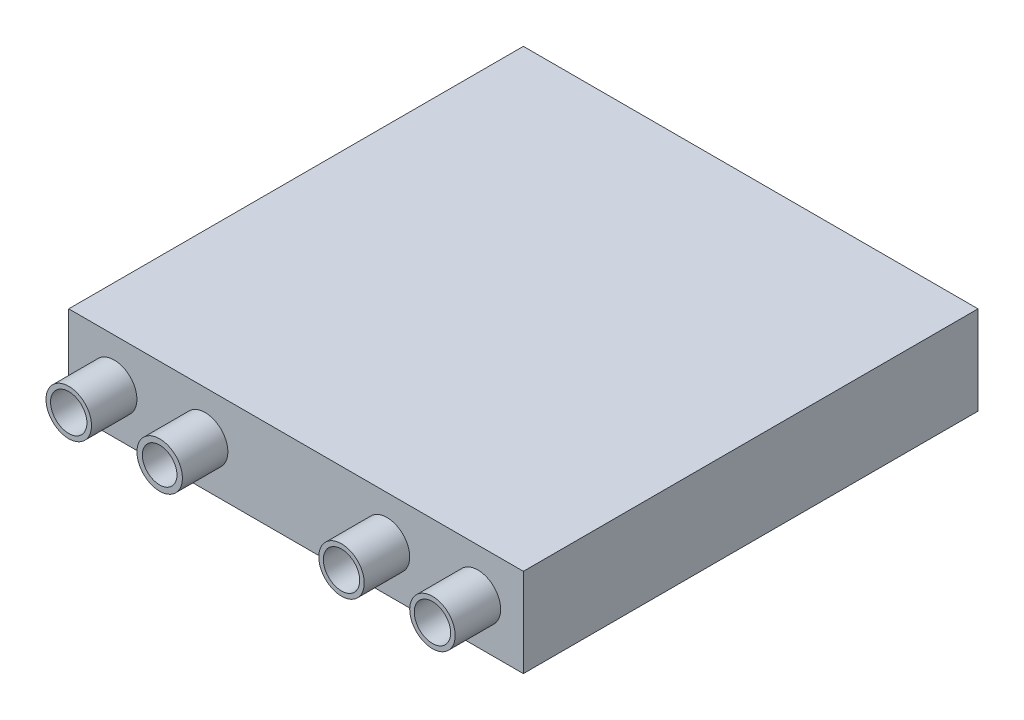
ISO-10303-21;
HEADER;
FILE_DESCRIPTION(('STEP AP214'),'2;1');
FILE_NAME('part.step','',(''),(''),'','','');
FILE_SCHEMA(('AUTOMOTIVE_DESIGN { 1 0 10303 214 1 1 1 1 }'));
ENDSEC;
DATA;
#1=APPLICATION_CONTEXT('core data for automotive mechanical design processes');
#2=APPLICATION_PROTOCOL_DEFINITION('international standard','automotive_design',2000,#1);
#3=PRODUCT_CONTEXT('',#1,'mechanical');
#4=PRODUCT('Part','Part','',(#3));
#5=PRODUCT_RELATED_PRODUCT_CATEGORY('part','',(#4));
#6=PRODUCT_DEFINITION_FORMATION('','',#4);
#7=PRODUCT_DEFINITION_CONTEXT('part definition',#1,'design');
#8=PRODUCT_DEFINITION('design','',#6,#7);
#9=PRODUCT_DEFINITION_SHAPE('','',#8);
#10=(LENGTH_UNIT() NAMED_UNIT(*) SI_UNIT(.MILLI.,.METRE.));
#11=(NAMED_UNIT(*) PLANE_ANGLE_UNIT() SI_UNIT($,.RADIAN.));
#12=(NAMED_UNIT(*) SI_UNIT($,.STERADIAN.) SOLID_ANGLE_UNIT());
#13=UNCERTAINTY_MEASURE_WITH_UNIT(LENGTH_MEASURE(1.E-05),#10,'distance_accuracy_value','');
#14=(GEOMETRIC_REPRESENTATION_CONTEXT(3) GLOBAL_UNCERTAINTY_ASSIGNED_CONTEXT((#13)) GLOBAL_UNIT_ASSIGNED_CONTEXT((#10,
#11,#12)) REPRESENTATION_CONTEXT('',''));
#15=CARTESIAN_POINT('',(0.,0.,0.));
#16=DIRECTION('',(0.,0.,1.));
#17=DIRECTION('',(1.,0.,0.));
#18=AXIS2_PLACEMENT_3D('',#15,#16,#17);
#19=CARTESIAN_POINT('',(0.,-195.,1000.));
#20=DIRECTION('',(0.,1.,0.));
#21=DIRECTION('',(0.,0.,1.));
#22=AXIS2_PLACEMENT_3D('',#19,#20,#21);
#23=PLANE('',#22);
#24=DIRECTION('',(1.,0.,0.));
#25=VECTOR('',#24,1.);
#26=CARTESIAN_POINT('',(0.,-195.,0.));
#27=LINE('',#26,#25);
#28=CARTESIAN_POINT('',(0.,-195.,0.));
#29=VERTEX_POINT('',#28);
#30=CARTESIAN_POINT('',(1000.,-195.,0.));
#31=VERTEX_POINT('',#30);
#32=EDGE_CURVE('E117',#29,#31,#27,.T.);
#33=ORIENTED_EDGE('',*,*,#32,.T.);
#34=DIRECTION('',(0.,0.,-1.));
#35=VECTOR('',#34,1.);
#36=CARTESIAN_POINT('',(1000.,-195.,1000.));
#37=LINE('',#36,#35);
#38=CARTESIAN_POINT('',(1000.,-195.,1000.));
#39=VERTEX_POINT('',#38);
#40=EDGE_CURVE('E103',#39,#31,#37,.T.);
#41=ORIENTED_EDGE('',*,*,#40,.F.);
#42=DIRECTION('',(1.,0.,0.));
#43=VECTOR('',#42,1.);
#44=CARTESIAN_POINT('',(0.,-195.,1000.));
#45=LINE('',#44,#43);
#46=CARTESIAN_POINT('',(0.,-195.,1000.));
#47=VERTEX_POINT('',#46);
#48=EDGE_CURVE('E87',#47,#39,#45,.T.);
#49=ORIENTED_EDGE('',*,*,#48,.F.);
#50=DIRECTION('',(0.,0.,-1.));
#51=VECTOR('',#50,1.);
#52=CARTESIAN_POINT('',(0.,-195.,1000.));
#53=LINE('',#52,#51);
#54=EDGE_CURVE('E113',#47,#29,#53,.T.);
#55=ORIENTED_EDGE('',*,*,#54,.T.);
#56=EDGE_LOOP('',(#33,#41,#49,#55));
#57=FACE_BOUND('',#56,.T.);
#58=ADVANCED_FACE('F46',(#57),#23,.F.);
#59=CARTESIAN_POINT('',(1000.,0.,1000.));
#60=DIRECTION('',(1.,0.,0.));
#61=DIRECTION('',(0.,1.,0.));
#62=AXIS2_PLACEMENT_3D('',#59,#60,#61);
#63=PLANE('',#62);
#64=DIRECTION('',(0.,-1.,0.));
#65=VECTOR('',#64,1.);
#66=CARTESIAN_POINT('',(1000.,0.,0.));
#67=LINE('',#66,#65);
#68=CARTESIAN_POINT('',(1000.,0.,0.));
#69=VERTEX_POINT('',#68);
#70=EDGE_CURVE('E97',#69,#31,#67,.T.);
#71=ORIENTED_EDGE('',*,*,#70,.F.);
#72=DIRECTION('',(0.,0.,-1.));
#73=VECTOR('',#72,1.);
#74=CARTESIAN_POINT('',(1000.,0.,1000.));
#75=LINE('',#74,#73);
#76=CARTESIAN_POINT('',(1000.,0.,1000.));
#77=VERTEX_POINT('',#76);
#78=EDGE_CURVE('E93',#77,#69,#75,.T.);
#79=ORIENTED_EDGE('',*,*,#78,.F.);
#80=DIRECTION('',(0.,-1.,0.));
#81=VECTOR('',#80,1.);
#82=CARTESIAN_POINT('',(1000.,0.,1000.));
#83=LINE('',#82,#81);
#84=EDGE_CURVE('E95',#77,#39,#83,.T.);
#85=ORIENTED_EDGE('',*,*,#84,.T.);
#86=ORIENTED_EDGE('',*,*,#40,.T.);
#87=EDGE_LOOP('',(#71,#79,#85,#86));
#88=FACE_BOUND('',#87,.T.);
#89=ADVANCED_FACE('F94',(#88),#63,.T.);
#90=CARTESIAN_POINT('',(0.,0.,1000.));
#91=DIRECTION('',(0.,1.,0.));
#92=DIRECTION('',(0.,0.,1.));
#93=AXIS2_PLACEMENT_3D('',#90,#91,#92);
#94=PLANE('',#93);
#95=DIRECTION('',(1.,0.,0.));
#96=VECTOR('',#95,1.);
#97=CARTESIAN_POINT('',(0.,0.,0.));
#98=LINE('',#97,#96);
#99=CARTESIAN_POINT('',(0.,0.,0.));
#100=VERTEX_POINT('',#99);
#101=EDGE_CURVE('E124',#100,#69,#98,.T.);
#102=ORIENTED_EDGE('',*,*,#101,.F.);
#103=DIRECTION('',(0.,0.,-1.));
#104=VECTOR('',#103,1.);
#105=CARTESIAN_POINT('',(0.,0.,1000.));
#106=LINE('',#105,#104);
#107=CARTESIAN_POINT('',(0.,0.,1000.));
#108=VERTEX_POINT('',#107);
#109=EDGE_CURVE('E79',#108,#100,#106,.T.);
#110=ORIENTED_EDGE('',*,*,#109,.F.);
#111=DIRECTION('',(1.,0.,0.));
#112=VECTOR('',#111,1.);
#113=CARTESIAN_POINT('',(0.,0.,1000.));
#114=LINE('',#113,#112);
#115=EDGE_CURVE('E106',#108,#77,#114,.T.);
#116=ORIENTED_EDGE('',*,*,#115,.T.);
#117=ORIENTED_EDGE('',*,*,#78,.T.);
#118=EDGE_LOOP('',(#102,#110,#116,#117));
#119=FACE_BOUND('',#118,.T.);
#120=ADVANCED_FACE('F109',(#119),#94,.T.);
#121=CARTESIAN_POINT('',(0.,0.,1000.));
#122=DIRECTION('',(1.,0.,0.));
#123=DIRECTION('',(0.,1.,0.));
#124=AXIS2_PLACEMENT_3D('',#121,#122,#123);
#125=PLANE('',#124);
#126=DIRECTION('',(0.,-1.,0.));
#127=VECTOR('',#126,1.);
#128=CARTESIAN_POINT('',(0.,0.,0.));
#129=LINE('',#128,#127);
#130=EDGE_CURVE('E82',#100,#29,#129,.T.);
#131=ORIENTED_EDGE('',*,*,#130,.T.);
#132=ORIENTED_EDGE('',*,*,#54,.F.);
#133=DIRECTION('',(0.,-1.,0.));
#134=VECTOR('',#133,1.);
#135=CARTESIAN_POINT('',(0.,0.,1000.));
#136=LINE('',#135,#134);
#137=EDGE_CURVE('E63',#108,#47,#136,.T.);
#138=ORIENTED_EDGE('',*,*,#137,.F.);
#139=ORIENTED_EDGE('',*,*,#109,.T.);
#140=EDGE_LOOP('',(#131,#132,#138,#139));
#141=FACE_BOUND('',#140,.T.);
#142=ADVANCED_FACE('F151',(#141),#125,.F.);
#143=CARTESIAN_POINT('',(0.,0.,1000.));
#144=DIRECTION('',(0.,0.,-1.));
#145=DIRECTION('',(-1.,0.,0.));
#146=AXIS2_PLACEMENT_3D('',#143,#144,#145);
#147=PLANE('',#146);
#148=CARTESIAN_POINT('',(900.,-97.5,1000.));
#149=DIRECTION('',(0.,0.,-1.));
#150=DIRECTION('',(-1.,0.,0.));
#151=AXIS2_PLACEMENT_3D('',#148,#149,#150);
#152=CIRCLE('',#151,50.);
#153=CARTESIAN_POINT('',(850.,-97.5,1000.));
#154=VERTEX_POINT('',#153);
#155=EDGE_CURVE('E11',#154,#154,#152,.F.);
#156=ORIENTED_EDGE('',*,*,#155,.F.);
#157=EDGE_LOOP('',(#156));
#158=FACE_BOUND('',#157,.T.);
#159=CARTESIAN_POINT('',(700.,-97.5,1000.));
#160=DIRECTION('',(0.,0.,-1.));
#161=DIRECTION('',(-1.,0.,0.));
#162=AXIS2_PLACEMENT_3D('',#159,#160,#161);
#163=CIRCLE('',#162,50.);
#164=CARTESIAN_POINT('',(650.,-97.5,1000.));
#165=VERTEX_POINT('',#164);
#166=EDGE_CURVE('E55',#165,#165,#163,.F.);
#167=ORIENTED_EDGE('',*,*,#166,.F.);
#168=EDGE_LOOP('',(#167));
#169=FACE_BOUND('',#168,.T.);
#170=CARTESIAN_POINT('',(300.,-97.5,1000.));
#171=DIRECTION('',(0.,0.,-1.));
#172=DIRECTION('',(-1.,0.,0.));
#173=AXIS2_PLACEMENT_3D('',#170,#171,#172);
#174=CIRCLE('',#173,50.);
#175=CARTESIAN_POINT('',(250.,-97.5,1000.));
#176=VERTEX_POINT('',#175);
#177=EDGE_CURVE('E139',#176,#176,#174,.F.);
#178=ORIENTED_EDGE('',*,*,#177,.F.);
#179=EDGE_LOOP('',(#178));
#180=FACE_BOUND('',#179,.T.);
#181=CARTESIAN_POINT('',(100.,-97.5,1000.));
#182=DIRECTION('',(0.,0.,-1.));
#183=DIRECTION('',(-1.,0.,0.));
#184=AXIS2_PLACEMENT_3D('',#181,#182,#183);
#185=CIRCLE('',#184,50.);
#186=CARTESIAN_POINT('',(50.,-97.5,1000.));
#187=VERTEX_POINT('',#186);
#188=EDGE_CURVE('E135',#187,#187,#185,.F.);
#189=ORIENTED_EDGE('',*,*,#188,.F.);
#190=EDGE_LOOP('',(#189));
#191=FACE_BOUND('',#190,.T.);
#192=ORIENTED_EDGE('',*,*,#48,.T.);
#193=ORIENTED_EDGE('',*,*,#84,.F.);
#194=ORIENTED_EDGE('',*,*,#115,.F.);
#195=ORIENTED_EDGE('',*,*,#137,.T.);
#196=EDGE_LOOP('',(#192,#193,#194,#195));
#197=FACE_BOUND('',#196,.T.);
#198=ADVANCED_FACE('F105',(#158,#169,#180,#191,#197),#147,.F.);
#199=CARTESIAN_POINT('',(0.,0.,0.));
#200=DIRECTION('',(0.,0.,-1.));
#201=DIRECTION('',(-1.,0.,0.));
#202=AXIS2_PLACEMENT_3D('',#199,#200,#201);
#203=PLANE('',#202);
#204=ORIENTED_EDGE('',*,*,#32,.F.);
#205=ORIENTED_EDGE('',*,*,#130,.F.);
#206=ORIENTED_EDGE('',*,*,#101,.T.);
#207=ORIENTED_EDGE('',*,*,#70,.T.);
#208=EDGE_LOOP('',(#204,#205,#206,#207));
#209=FACE_BOUND('',#208,.T.);
#210=ADVANCED_FACE('F150',(#209),#203,.T.);
#211=CARTESIAN_POINT('',(100.,-97.5,1100.));
#212=DIRECTION('',(0.,0.,1.));
#213=DIRECTION('',(1.,0.,0.));
#214=AXIS2_PLACEMENT_3D('',#211,#212,#213);
#215=PLANE('',#214);
#216=CARTESIAN_POINT('',(100.,-97.5,1100.));
#217=DIRECTION('',(0.,0.,1.));
#218=DIRECTION('',(1.,0.,0.));
#219=AXIS2_PLACEMENT_3D('',#216,#217,#218);
#220=CIRCLE('',#219,50.);
#221=CARTESIAN_POINT('',(150.,-97.5,1100.));
#222=VERTEX_POINT('',#221);
#223=EDGE_CURVE('E121',#222,#222,#220,.T.);
#224=ORIENTED_EDGE('',*,*,#223,.T.);
#225=EDGE_LOOP('',(#224));
#226=FACE_BOUND('',#225,.T.);
#227=CARTESIAN_POINT('',(100.,-97.5,1100.));
#228=DIRECTION('',(0.,0.,1.));
#229=DIRECTION('',(1.,0.,0.));
#230=AXIS2_PLACEMENT_3D('',#227,#228,#229);
#231=CIRCLE('',#230,40.);
#232=CARTESIAN_POINT('',(140.,-97.5,1100.));
#233=VERTEX_POINT('',#232);
#234=EDGE_CURVE('E500',#233,#233,#231,.T.);
#235=ORIENTED_EDGE('',*,*,#234,.F.);
#236=EDGE_LOOP('',(#235));
#237=FACE_BOUND('',#236,.T.);
#238=ADVANCED_FACE('F161',(#226,#237),#215,.T.);
#239=CARTESIAN_POINT('',(100.,-97.5,1100.));
#240=DIRECTION('',(0.,0.,-1.));
#241=DIRECTION('',(-1.,0.,0.));
#242=AXIS2_PLACEMENT_3D('',#239,#240,#241);
#243=CYLINDRICAL_SURFACE('',#242,50.);
#244=ORIENTED_EDGE('',*,*,#223,.F.);
#245=EDGE_LOOP('',(#244));
#246=FACE_BOUND('',#245,.T.);
#247=ORIENTED_EDGE('',*,*,#188,.T.);
#248=EDGE_LOOP('',(#247));
#249=FACE_BOUND('',#248,.T.);
#250=ADVANCED_FACE('F158',(#246,#249),#243,.T.);
#251=CARTESIAN_POINT('',(100.,-97.5,1100.));
#252=DIRECTION('',(0.,0.,-1.));
#253=DIRECTION('',(-1.,0.,0.));
#254=AXIS2_PLACEMENT_3D('',#251,#252,#253);
#255=CYLINDRICAL_SURFACE('',#254,40.);
#256=ORIENTED_EDGE('',*,*,#234,.T.);
#257=EDGE_LOOP('',(#256));
#258=FACE_BOUND('',#257,.T.);
#259=CARTESIAN_POINT('',(100.,-97.5,35.9999999999985));
#260=DIRECTION('',(0.,0.,1.));
#261=DIRECTION('',(1.,0.,0.));
#262=AXIS2_PLACEMENT_3D('',#259,#260,#261);
#263=CIRCLE('',#262,40.);
#264=CARTESIAN_POINT('',(140.,-97.5,35.9999999999985));
#265=VERTEX_POINT('',#264);
#266=EDGE_CURVE('E459',#265,#265,#263,.T.);
#267=ORIENTED_EDGE('',*,*,#266,.F.);
#268=EDGE_LOOP('',(#267));
#269=FACE_BOUND('',#268,.T.);
#270=ADVANCED_FACE('F160',(#258,#269),#255,.F.);
#271=CARTESIAN_POINT('',(300.,-97.5,1100.));
#272=DIRECTION('',(0.,0.,1.));
#273=DIRECTION('',(1.,0.,0.));
#274=AXIS2_PLACEMENT_3D('',#271,#272,#273);
#275=PLANE('',#274);
#276=CARTESIAN_POINT('',(300.,-97.5,1100.));
#277=DIRECTION('',(0.,0.,1.));
#278=DIRECTION('',(1.,0.,0.));
#279=AXIS2_PLACEMENT_3D('',#276,#277,#278);
#280=CIRCLE('',#279,50.);
#281=CARTESIAN_POINT('',(350.,-97.5,1100.));
#282=VERTEX_POINT('',#281);
#283=EDGE_CURVE('E492',#282,#282,#280,.T.);
#284=ORIENTED_EDGE('',*,*,#283,.T.);
#285=EDGE_LOOP('',(#284));
#286=FACE_BOUND('',#285,.T.);
#287=CARTESIAN_POINT('',(300.,-97.5,1100.));
#288=DIRECTION('',(0.,0.,1.));
#289=DIRECTION('',(1.,0.,0.));
#290=AXIS2_PLACEMENT_3D('',#287,#288,#289);
#291=CIRCLE('',#290,38.0497716741225);
#292=CARTESIAN_POINT('',(338.049771674123,-97.5,1100.));
#293=VERTEX_POINT('',#292);
#294=EDGE_CURVE('E496',#293,#293,#291,.T.);
#295=ORIENTED_EDGE('',*,*,#294,.F.);
#296=EDGE_LOOP('',(#295));
#297=FACE_BOUND('',#296,.T.);
#298=ADVANCED_FACE('F168',(#286,#297),#275,.T.);
#299=CARTESIAN_POINT('',(300.,-97.5,1100.));
#300=DIRECTION('',(0.,0.,-1.));
#301=DIRECTION('',(-1.,0.,0.));
#302=AXIS2_PLACEMENT_3D('',#299,#300,#301);
#303=CYLINDRICAL_SURFACE('',#302,50.);
#304=ORIENTED_EDGE('',*,*,#283,.F.);
#305=EDGE_LOOP('',(#304));
#306=FACE_BOUND('',#305,.T.);
#307=ORIENTED_EDGE('',*,*,#177,.T.);
#308=EDGE_LOOP('',(#307));
#309=FACE_BOUND('',#308,.T.);
#310=ADVANCED_FACE('F240',(#306,#309),#303,.T.);
#311=CARTESIAN_POINT('',(300.,-97.5,1100.));
#312=DIRECTION('',(0.,0.,-1.));
#313=DIRECTION('',(-1.,0.,0.));
#314=AXIS2_PLACEMENT_3D('',#311,#312,#313);
#315=CYLINDRICAL_SURFACE('',#314,38.0497716741225);
#316=ORIENTED_EDGE('',*,*,#294,.T.);
#317=EDGE_LOOP('',(#316));
#318=FACE_BOUND('',#317,.T.);
#319=CARTESIAN_POINT('',(300.,-97.5,35.9999999999985));
#320=DIRECTION('',(0.,0.,1.));
#321=DIRECTION('',(1.,0.,0.));
#322=AXIS2_PLACEMENT_3D('',#319,#320,#321);
#323=CIRCLE('',#322,38.0497716741225);
#324=CARTESIAN_POINT('',(338.049771674123,-97.5,35.9999999999985));
#325=VERTEX_POINT('',#324);
#326=EDGE_CURVE('E463',#325,#325,#323,.T.);
#327=ORIENTED_EDGE('',*,*,#326,.F.);
#328=EDGE_LOOP('',(#327));
#329=FACE_BOUND('',#328,.T.);
#330=ADVANCED_FACE('F244',(#318,#329),#315,.F.);
#331=CARTESIAN_POINT('',(700.,-97.5,1100.));
#332=DIRECTION('',(0.,0.,1.));
#333=DIRECTION('',(1.,0.,0.));
#334=AXIS2_PLACEMENT_3D('',#331,#332,#333);
#335=PLANE('',#334);
#336=CARTESIAN_POINT('',(700.,-97.5,1100.));
#337=DIRECTION('',(0.,0.,1.));
#338=DIRECTION('',(1.,0.,0.));
#339=AXIS2_PLACEMENT_3D('',#336,#337,#338);
#340=CIRCLE('',#339,50.);
#341=CARTESIAN_POINT('',(750.,-97.5,1100.));
#342=VERTEX_POINT('',#341);
#343=EDGE_CURVE('E484',#342,#342,#340,.T.);
#344=ORIENTED_EDGE('',*,*,#343,.T.);
#345=EDGE_LOOP('',(#344));
#346=FACE_BOUND('',#345,.T.);
#347=CARTESIAN_POINT('',(700.,-97.5,1100.));
#348=DIRECTION('',(0.,0.,1.));
#349=DIRECTION('',(1.,0.,0.));
#350=AXIS2_PLACEMENT_3D('',#347,#348,#349);
#351=CIRCLE('',#350,40.);
#352=CARTESIAN_POINT('',(740.,-97.5,1100.));
#353=VERTEX_POINT('',#352);
#354=EDGE_CURVE('E488',#353,#353,#351,.T.);
#355=ORIENTED_EDGE('',*,*,#354,.F.);
#356=EDGE_LOOP('',(#355));
#357=FACE_BOUND('',#356,.T.);
#358=ADVANCED_FACE('F215',(#346,#357),#335,.T.);
#359=CARTESIAN_POINT('',(700.,-97.5,1100.));
#360=DIRECTION('',(0.,0.,-1.));
#361=DIRECTION('',(-1.,0.,0.));
#362=AXIS2_PLACEMENT_3D('',#359,#360,#361);
#363=CYLINDRICAL_SURFACE('',#362,50.);
#364=ORIENTED_EDGE('',*,*,#343,.F.);
#365=EDGE_LOOP('',(#364));
#366=FACE_BOUND('',#365,.T.);
#367=ORIENTED_EDGE('',*,*,#166,.T.);
#368=EDGE_LOOP('',(#367));
#369=FACE_BOUND('',#368,.T.);
#370=ADVANCED_FACE('F146',(#366,#369),#363,.T.);
#371=CARTESIAN_POINT('',(700.,-97.5,1100.));
#372=DIRECTION('',(0.,0.,-1.));
#373=DIRECTION('',(-1.,0.,0.));
#374=AXIS2_PLACEMENT_3D('',#371,#372,#373);
#375=CYLINDRICAL_SURFACE('',#374,40.);
#376=ORIENTED_EDGE('',*,*,#354,.T.);
#377=EDGE_LOOP('',(#376));
#378=FACE_BOUND('',#377,.T.);
#379=CARTESIAN_POINT('',(700.,-97.5,35.9999999999985));
#380=DIRECTION('',(0.,0.,1.));
#381=DIRECTION('',(1.,0.,0.));
#382=AXIS2_PLACEMENT_3D('',#379,#380,#381);
#383=CIRCLE('',#382,40.);
#384=CARTESIAN_POINT('',(740.,-97.5,35.9999999999985));
#385=VERTEX_POINT('',#384);
#386=EDGE_CURVE('E471',#385,#385,#383,.T.);
#387=ORIENTED_EDGE('',*,*,#386,.F.);
#388=EDGE_LOOP('',(#387));
#389=FACE_BOUND('',#388,.T.);
#390=ADVANCED_FACE('F214',(#378,#389),#375,.F.);
#391=CARTESIAN_POINT('',(900.,-97.5,1100.));
#392=DIRECTION('',(0.,0.,1.));
#393=DIRECTION('',(1.,0.,0.));
#394=AXIS2_PLACEMENT_3D('',#391,#392,#393);
#395=PLANE('',#394);
#396=CARTESIAN_POINT('',(900.,-97.5,1100.));
#397=DIRECTION('',(0.,0.,1.));
#398=DIRECTION('',(1.,0.,0.));
#399=AXIS2_PLACEMENT_3D('',#396,#397,#398);
#400=CIRCLE('',#399,50.);
#401=CARTESIAN_POINT('',(950.,-97.5,1100.));
#402=VERTEX_POINT('',#401);
#403=EDGE_CURVE('E462',#402,#402,#400,.T.);
#404=ORIENTED_EDGE('',*,*,#403,.T.);
#405=EDGE_LOOP('',(#404));
#406=FACE_BOUND('',#405,.T.);
#407=CARTESIAN_POINT('',(900.,-97.5,1100.));
#408=DIRECTION('',(0.,0.,1.));
#409=DIRECTION('',(1.,0.,0.));
#410=AXIS2_PLACEMENT_3D('',#407,#408,#409);
#411=CIRCLE('',#410,40.);
#412=CARTESIAN_POINT('',(940.,-97.5,1100.));
#413=VERTEX_POINT('',#412);
#414=EDGE_CURVE('E468',#413,#413,#411,.T.);
#415=ORIENTED_EDGE('',*,*,#414,.F.);
#416=EDGE_LOOP('',(#415));
#417=FACE_BOUND('',#416,.T.);
#418=ADVANCED_FACE('F231',(#406,#417),#395,.T.);
#419=CARTESIAN_POINT('',(900.,-97.5,1100.));
#420=DIRECTION('',(0.,0.,-1.));
#421=DIRECTION('',(-1.,0.,0.));
#422=AXIS2_PLACEMENT_3D('',#419,#420,#421);
#423=CYLINDRICAL_SURFACE('',#422,50.);
#424=ORIENTED_EDGE('',*,*,#403,.F.);
#425=EDGE_LOOP('',(#424));
#426=FACE_BOUND('',#425,.T.);
#427=ORIENTED_EDGE('',*,*,#155,.T.);
#428=EDGE_LOOP('',(#427));
#429=FACE_BOUND('',#428,.T.);
#430=ADVANCED_FACE('F225',(#426,#429),#423,.T.);
#431=CARTESIAN_POINT('',(900.,-97.5,1100.));
#432=DIRECTION('',(0.,0.,-1.));
#433=DIRECTION('',(-1.,0.,0.));
#434=AXIS2_PLACEMENT_3D('',#431,#432,#433);
#435=CYLINDRICAL_SURFACE('',#434,40.);
#436=ORIENTED_EDGE('',*,*,#414,.T.);
#437=EDGE_LOOP('',(#436));
#438=FACE_BOUND('',#437,.T.);
#439=CARTESIAN_POINT('',(900.,-97.5,35.9999999999985));
#440=DIRECTION('',(0.,0.,1.));
#441=DIRECTION('',(1.,0.,0.));
#442=AXIS2_PLACEMENT_3D('',#439,#440,#441);
#443=CIRCLE('',#442,40.);
#444=CARTESIAN_POINT('',(940.,-97.5,35.9999999999985));
#445=VERTEX_POINT('',#444);
#446=EDGE_CURVE('E477',#445,#445,#443,.T.);
#447=ORIENTED_EDGE('',*,*,#446,.F.);
#448=EDGE_LOOP('',(#447));
#449=FACE_BOUND('',#448,.T.);
#450=ADVANCED_FACE('F230',(#438,#449),#435,.F.);
#451=CARTESIAN_POINT('',(900.,-97.5,35.9999999999985));
#452=DIRECTION('',(0.,0.,1.));
#453=DIRECTION('',(1.,0.,0.));
#454=AXIS2_PLACEMENT_3D('',#451,#452,#453);
#455=PLANE('',#454);
#456=ORIENTED_EDGE('',*,*,#446,.T.);
#457=EDGE_LOOP('',(#456));
#458=FACE_BOUND('',#457,.T.);
#459=ADVANCED_FACE('F309',(#458),#455,.T.);
#460=CARTESIAN_POINT('',(700.,-97.5,35.9999999999985));
#461=DIRECTION('',(0.,0.,1.));
#462=DIRECTION('',(1.,0.,0.));
#463=AXIS2_PLACEMENT_3D('',#460,#461,#462);
#464=PLANE('',#463);
#465=ORIENTED_EDGE('',*,*,#386,.T.);
#466=EDGE_LOOP('',(#465));
#467=FACE_BOUND('',#466,.T.);
#468=ADVANCED_FACE('F417',(#467),#464,.T.);
#469=CARTESIAN_POINT('',(300.,-97.5,35.9999999999985));
#470=DIRECTION('',(0.,0.,1.));
#471=DIRECTION('',(1.,0.,0.));
#472=AXIS2_PLACEMENT_3D('',#469,#470,#471);
#473=PLANE('',#472);
#474=ORIENTED_EDGE('',*,*,#326,.T.);
#475=EDGE_LOOP('',(#474));
#476=FACE_BOUND('',#475,.T.);
#477=ADVANCED_FACE('F428',(#476),#473,.T.);
#478=CARTESIAN_POINT('',(100.,-97.5,35.9999999999985));
#479=DIRECTION('',(0.,0.,1.));
#480=DIRECTION('',(1.,0.,0.));
#481=AXIS2_PLACEMENT_3D('',#478,#479,#480);
#482=PLANE('',#481);
#483=ORIENTED_EDGE('',*,*,#266,.T.);
#484=EDGE_LOOP('',(#483));
#485=FACE_BOUND('',#484,.T.);
#486=ADVANCED_FACE('F439',(#485),#482,.T.);
#487=CLOSED_SHELL('',(#58,#89,#120,#142,#198,#210,#238,#250,#270,#298,#310,#330,#358,#370,#390,
#418,#430,#450,#459,#468,#477,#486));
#488=MANIFOLD_SOLID_BREP('B2',#487);
#489=ADVANCED_BREP_SHAPE_REPRESENTATION('',(#18,#488),#14);
#490=SHAPE_DEFINITION_REPRESENTATION(#9,#489);
ENDSEC;
END-ISO-10303-21;
